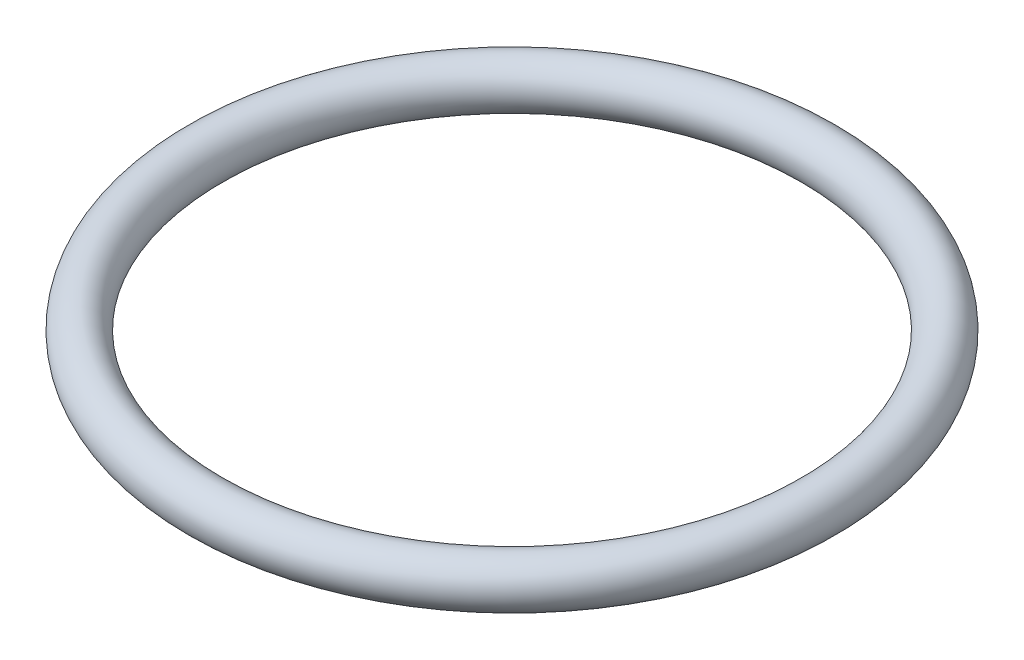
ISO-10303-21;
HEADER;
FILE_DESCRIPTION(('STEP AP214'),'2;1');
FILE_NAME('part.step','',(''),(''),'','','');
FILE_SCHEMA(('AUTOMOTIVE_DESIGN { 1 0 10303 214 1 1 1 1 }'));
ENDSEC;
DATA;
#1=APPLICATION_CONTEXT('core data for automotive mechanical design processes');
#2=APPLICATION_PROTOCOL_DEFINITION('international standard','automotive_design',2000,#1);
#3=PRODUCT_CONTEXT('',#1,'mechanical');
#4=PRODUCT('Part','Part','',(#3));
#5=PRODUCT_RELATED_PRODUCT_CATEGORY('part','',(#4));
#6=PRODUCT_DEFINITION_FORMATION('','',#4);
#7=PRODUCT_DEFINITION_CONTEXT('part definition',#1,'design');
#8=PRODUCT_DEFINITION('design','',#6,#7);
#9=PRODUCT_DEFINITION_SHAPE('','',#8);
#10=(LENGTH_UNIT() NAMED_UNIT(*) SI_UNIT(.MILLI.,.METRE.));
#11=(NAMED_UNIT(*) PLANE_ANGLE_UNIT() SI_UNIT($,.RADIAN.));
#12=(NAMED_UNIT(*) SI_UNIT($,.STERADIAN.) SOLID_ANGLE_UNIT());
#13=UNCERTAINTY_MEASURE_WITH_UNIT(LENGTH_MEASURE(1.E-05),#10,'distance_accuracy_value','');
#14=(GEOMETRIC_REPRESENTATION_CONTEXT(3) GLOBAL_UNCERTAINTY_ASSIGNED_CONTEXT((#13)) GLOBAL_UNIT_ASSIGNED_CONTEXT((#10,
#11,#12)) REPRESENTATION_CONTEXT('',''));
#15=CARTESIAN_POINT('',(0.,0.,0.));
#16=DIRECTION('',(0.,0.,1.));
#17=DIRECTION('',(1.,0.,0.));
#18=AXIS2_PLACEMENT_3D('',#15,#16,#17);
#19=CARTESIAN_POINT('',(0.,0.,0.));
#20=DIRECTION('',(0.,-1.,0.));
#21=DIRECTION('',(0.,0.,-1.));
#22=AXIS2_PLACEMENT_3D('',#19,#20,#21);
#23=TOROIDAL_SURFACE('',#22,20.6375,1.5875);
#24=CARTESIAN_POINT('',(0.,0.,-22.225));
#25=VERTEX_POINT('',#24);
#26=VERTEX_LOOP('',#25);
#27=FACE_BOUND('',#26,.T.);
#28=ADVANCED_FACE('F30',(#27),#23,.T.);
#29=CLOSED_SHELL('',(#28));
#30=MANIFOLD_SOLID_BREP('B2',#29);
#31=ADVANCED_BREP_SHAPE_REPRESENTATION('',(#18,#30),#14);
#32=SHAPE_DEFINITION_REPRESENTATION(#9,#31);
ENDSEC;
END-ISO-10303-21;
